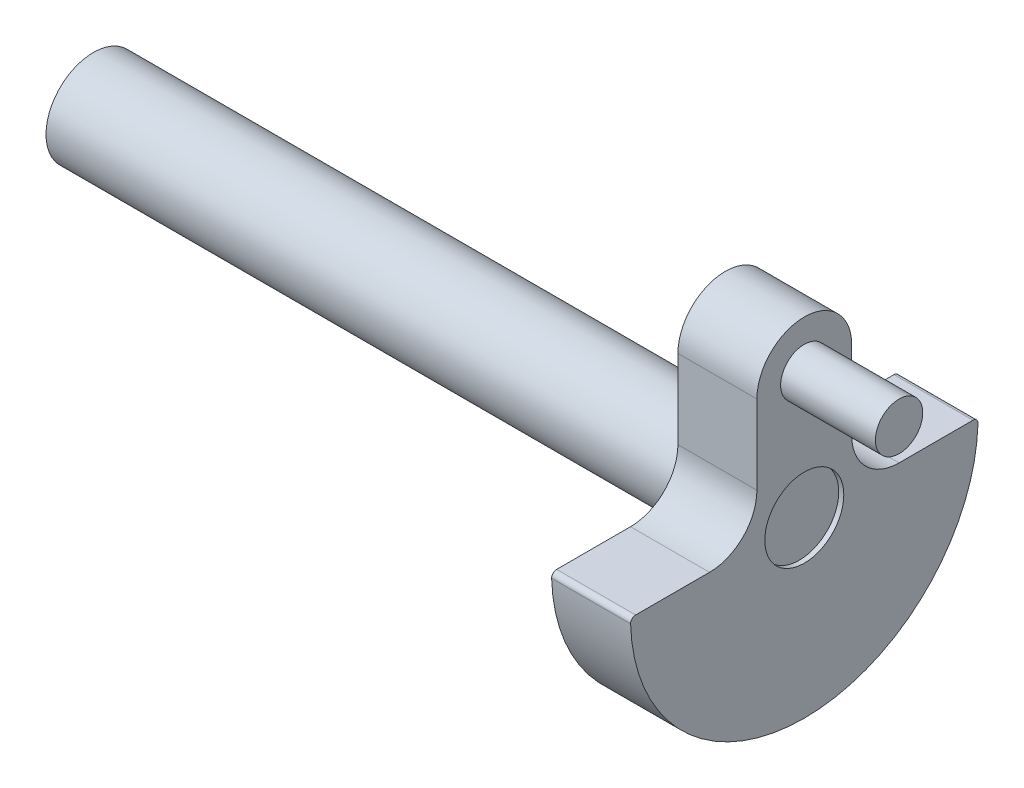
ISO-10303-21;
HEADER;
FILE_DESCRIPTION(('STEP AP214'),'2;1');
FILE_NAME('part.step','',(''),(''),'','','');
FILE_SCHEMA(('AUTOMOTIVE_DESIGN { 1 0 10303 214 1 1 1 1 }'));
ENDSEC;
DATA;
#1=APPLICATION_CONTEXT('core data for automotive mechanical design processes');
#2=APPLICATION_PROTOCOL_DEFINITION('international standard','automotive_design',2000,#1);
#3=PRODUCT_CONTEXT('',#1,'mechanical');
#4=PRODUCT('Part','Part','',(#3));
#5=PRODUCT_RELATED_PRODUCT_CATEGORY('part','',(#4));
#6=PRODUCT_DEFINITION_FORMATION('','',#4);
#7=PRODUCT_DEFINITION_CONTEXT('part definition',#1,'design');
#8=PRODUCT_DEFINITION('design','',#6,#7);
#9=PRODUCT_DEFINITION_SHAPE('','',#8);
#10=(LENGTH_UNIT() NAMED_UNIT(*) SI_UNIT(.MILLI.,.METRE.));
#11=(NAMED_UNIT(*) PLANE_ANGLE_UNIT() SI_UNIT($,.RADIAN.));
#12=(NAMED_UNIT(*) SI_UNIT($,.STERADIAN.) SOLID_ANGLE_UNIT());
#13=UNCERTAINTY_MEASURE_WITH_UNIT(LENGTH_MEASURE(1.E-05),#10,'distance_accuracy_value','');
#14=(GEOMETRIC_REPRESENTATION_CONTEXT(3) GLOBAL_UNCERTAINTY_ASSIGNED_CONTEXT((#13)) GLOBAL_UNIT_ASSIGNED_CONTEXT((#10,
#11,#12)) REPRESENTATION_CONTEXT('',''));
#15=CARTESIAN_POINT('',(0.,0.,0.));
#16=DIRECTION('',(0.,0.,1.));
#17=DIRECTION('',(1.,0.,0.));
#18=AXIS2_PLACEMENT_3D('',#15,#16,#17);
#19=CARTESIAN_POINT('',(3.96875,-0.254,8.4734439021274));
#20=DIRECTION('',(-1.,0.,0.));
#21=DIRECTION('',(0.,0.,1.));
#22=AXIS2_PLACEMENT_3D('',#19,#20,#21);
#23=CYLINDRICAL_SURFACE('',#22,0.254000000000001);
#24=CARTESIAN_POINT('',(0.,-0.254,8.4734439021274));
#25=DIRECTION('',(1.,0.,0.));
#26=DIRECTION('',(0.,0.,1.));
#27=AXIS2_PLACEMENT_3D('',#24,#25,#26);
#28=CIRCLE('',#27,0.254000000000001);
#29=CARTESIAN_POINT('',(0.,0.,8.4734439021274));
#30=VERTEX_POINT('',#29);
#31=CARTESIAN_POINT('',(0.,-0.261610486891384,8.7273298617417));
#32=VERTEX_POINT('',#31);
#33=EDGE_CURVE('E147',#30,#32,#28,.T.);
#34=ORIENTED_EDGE('',*,*,#33,.T.);
#35=DIRECTION('',(-1.,0.,0.));
#36=VECTOR('',#35,1.);
#37=CARTESIAN_POINT('',(3.96875,-0.261610486891384,8.7273298617417));
#38=LINE('',#37,#36);
#39=CARTESIAN_POINT('',(3.96875,-0.261610486891384,8.7273298617417));
#40=VERTEX_POINT('',#39);
#41=EDGE_CURVE('E11',#40,#32,#38,.T.);
#42=ORIENTED_EDGE('',*,*,#41,.F.);
#43=CARTESIAN_POINT('',(3.96875,-0.254,8.4734439021274));
#44=DIRECTION('',(1.,0.,0.));
#45=DIRECTION('',(0.,0.,1.));
#46=AXIS2_PLACEMENT_3D('',#43,#44,#45);
#47=CIRCLE('',#46,0.254000000000001);
#48=CARTESIAN_POINT('',(3.96875,0.,8.4734439021274));
#49=VERTEX_POINT('',#48);
#50=EDGE_CURVE('E166',#49,#40,#47,.T.);
#51=ORIENTED_EDGE('',*,*,#50,.F.);
#52=DIRECTION('',(-1.,0.,0.));
#53=VECTOR('',#52,1.);
#54=CARTESIAN_POINT('',(3.96875,0.,8.4734439021274));
#55=LINE('',#54,#53);
#56=EDGE_CURVE('E143',#49,#30,#55,.T.);
#57=ORIENTED_EDGE('',*,*,#56,.T.);
#58=EDGE_LOOP('',(#34,#42,#51,#57));
#59=FACE_BOUND('',#58,.T.);
#60=ADVANCED_FACE('F39',(#59),#23,.T.);
#61=CARTESIAN_POINT('',(3.96875,0.,0.));
#62=DIRECTION('',(-1.,0.,0.));
#63=DIRECTION('',(0.,0.,1.));
#64=AXIS2_PLACEMENT_3D('',#61,#62,#63);
#65=CYLINDRICAL_SURFACE('',#64,8.73125);
#66=CARTESIAN_POINT('',(0.,0.,0.));
#67=DIRECTION('',(1.,0.,0.));
#68=DIRECTION('',(0.,0.,-1.));
#69=AXIS2_PLACEMENT_3D('',#66,#67,#68);
#70=CIRCLE('',#69,8.73125);
#71=CARTESIAN_POINT('',(0.,-0.261610486891387,-8.7273298617417));
#72=VERTEX_POINT('',#71);
#73=EDGE_CURVE('E150',#32,#72,#70,.T.);
#74=ORIENTED_EDGE('',*,*,#73,.T.);
#75=DIRECTION('',(-1.,0.,0.));
#76=VECTOR('',#75,1.);
#77=CARTESIAN_POINT('',(3.96875,-0.261610486891387,-8.7273298617417));
#78=LINE('',#77,#76);
#79=CARTESIAN_POINT('',(3.96875,-0.261610486891387,-8.7273298617417));
#80=VERTEX_POINT('',#79);
#81=EDGE_CURVE('E47',#80,#72,#78,.T.);
#82=ORIENTED_EDGE('',*,*,#81,.F.);
#83=CARTESIAN_POINT('',(3.96875,0.,0.));
#84=DIRECTION('',(1.,0.,0.));
#85=DIRECTION('',(0.,0.,-1.));
#86=AXIS2_PLACEMENT_3D('',#83,#84,#85);
#87=CIRCLE('',#86,8.73125);
#88=EDGE_CURVE('E104',#40,#80,#87,.T.);
#89=ORIENTED_EDGE('',*,*,#88,.F.);
#90=ORIENTED_EDGE('',*,*,#41,.T.);
#91=EDGE_LOOP('',(#74,#82,#89,#90));
#92=FACE_BOUND('',#91,.T.);
#93=ADVANCED_FACE('F261',(#92),#65,.T.);
#94=CARTESIAN_POINT('',(3.96875,-0.254,-8.4734439021274));
#95=DIRECTION('',(-1.,0.,0.));
#96=DIRECTION('',(0.,0.,1.));
#97=AXIS2_PLACEMENT_3D('',#94,#95,#96);
#98=CYLINDRICAL_SURFACE('',#97,0.254000000000001);
#99=CARTESIAN_POINT('',(0.,-0.254,-8.4734439021274));
#100=DIRECTION('',(1.,0.,0.));
#101=DIRECTION('',(0.,0.,1.));
#102=AXIS2_PLACEMENT_3D('',#99,#100,#101);
#103=CIRCLE('',#102,0.254000000000001);
#104=CARTESIAN_POINT('',(0.,0.,-8.4734439021274));
#105=VERTEX_POINT('',#104);
#106=EDGE_CURVE('E153',#72,#105,#103,.T.);
#107=ORIENTED_EDGE('',*,*,#106,.T.);
#108=DIRECTION('',(-1.,0.,0.));
#109=VECTOR('',#108,1.);
#110=CARTESIAN_POINT('',(3.96875,0.,-8.4734439021274));
#111=LINE('',#110,#109);
#112=CARTESIAN_POINT('',(3.96875,0.,-8.4734439021274));
#113=VERTEX_POINT('',#112);
#114=EDGE_CURVE('E179',#113,#105,#111,.T.);
#115=ORIENTED_EDGE('',*,*,#114,.F.);
#116=CARTESIAN_POINT('',(3.96875,-0.254,-8.4734439021274));
#117=DIRECTION('',(1.,0.,0.));
#118=DIRECTION('',(0.,0.,1.));
#119=AXIS2_PLACEMENT_3D('',#116,#117,#118);
#120=CIRCLE('',#119,0.254000000000001);
#121=EDGE_CURVE('E187',#80,#113,#120,.T.);
#122=ORIENTED_EDGE('',*,*,#121,.F.);
#123=ORIENTED_EDGE('',*,*,#81,.T.);
#124=EDGE_LOOP('',(#107,#115,#122,#123));
#125=FACE_BOUND('',#124,.T.);
#126=ADVANCED_FACE('F185',(#125),#98,.T.);
#127=CARTESIAN_POINT('',(3.96875,0.,-4.76250000000002));
#128=DIRECTION('',(0.,-1.,0.));
#129=DIRECTION('',(0.,0.,-1.));
#130=AXIS2_PLACEMENT_3D('',#127,#128,#129);
#131=PLANE('',#130);
#132=DIRECTION('',(0.,0.,1.));
#133=VECTOR('',#132,1.);
#134=CARTESIAN_POINT('',(0.,0.,-4.76250000000002));
#135=LINE('',#134,#133);
#136=CARTESIAN_POINT('',(0.,0.,-4.76250000000002));
#137=VERTEX_POINT('',#136);
#138=EDGE_CURVE('E155',#105,#137,#135,.T.);
#139=ORIENTED_EDGE('',*,*,#138,.T.);
#140=DIRECTION('',(-1.,0.,0.));
#141=VECTOR('',#140,1.);
#142=CARTESIAN_POINT('',(3.96875,0.,-4.76250000000002));
#143=LINE('',#142,#141);
#144=CARTESIAN_POINT('',(3.96875,0.,-4.76250000000002));
#145=VERTEX_POINT('',#144);
#146=EDGE_CURVE('E176',#145,#137,#143,.T.);
#147=ORIENTED_EDGE('',*,*,#146,.F.);
#148=DIRECTION('',(0.,0.,1.));
#149=VECTOR('',#148,1.);
#150=CARTESIAN_POINT('',(3.96875,0.,-4.76250000000002));
#151=LINE('',#150,#149);
#152=EDGE_CURVE('E205',#113,#145,#151,.T.);
#153=ORIENTED_EDGE('',*,*,#152,.F.);
#154=ORIENTED_EDGE('',*,*,#114,.T.);
#155=EDGE_LOOP('',(#139,#147,#153,#154));
#156=FACE_BOUND('',#155,.T.);
#157=ADVANCED_FACE('F196',(#156),#131,.F.);
#158=CARTESIAN_POINT('',(3.96875,2.38125,-4.7625));
#159=DIRECTION('',(-1.,0.,0.));
#160=DIRECTION('',(0.,0.,1.));
#161=AXIS2_PLACEMENT_3D('',#158,#159,#160);
#162=CYLINDRICAL_SURFACE('',#161,2.38125);
#163=CARTESIAN_POINT('',(0.,2.38125,-4.7625));
#164=DIRECTION('',(-1.,0.,0.));
#165=DIRECTION('',(0.,0.,1.));
#166=AXIS2_PLACEMENT_3D('',#163,#164,#165);
#167=CIRCLE('',#166,2.38125);
#168=CARTESIAN_POINT('',(0.,2.38125,-2.38125));
#169=VERTEX_POINT('',#168);
#170=EDGE_CURVE('E157',#137,#169,#167,.T.);
#171=ORIENTED_EDGE('',*,*,#170,.T.);
#172=DIRECTION('',(-1.,0.,0.));
#173=VECTOR('',#172,1.);
#174=CARTESIAN_POINT('',(3.96875,2.38125,-2.38125));
#175=LINE('',#174,#173);
#176=CARTESIAN_POINT('',(3.96875,2.38125,-2.38125));
#177=VERTEX_POINT('',#176);
#178=EDGE_CURVE('E173',#177,#169,#175,.T.);
#179=ORIENTED_EDGE('',*,*,#178,.F.);
#180=CARTESIAN_POINT('',(3.96875,2.38125,-4.7625));
#181=DIRECTION('',(-1.,0.,0.));
#182=DIRECTION('',(0.,0.,1.));
#183=AXIS2_PLACEMENT_3D('',#180,#181,#182);
#184=CIRCLE('',#183,2.38125);
#185=EDGE_CURVE('E202',#145,#177,#184,.T.);
#186=ORIENTED_EDGE('',*,*,#185,.F.);
#187=ORIENTED_EDGE('',*,*,#146,.T.);
#188=EDGE_LOOP('',(#171,#179,#186,#187));
#189=FACE_BOUND('',#188,.T.);
#190=ADVANCED_FACE('F200',(#189),#162,.F.);
#191=CARTESIAN_POINT('',(3.96875,6.35,-2.38125));
#192=DIRECTION('',(0.,0.,1.));
#193=DIRECTION('',(0.,-1.,0.));
#194=AXIS2_PLACEMENT_3D('',#191,#192,#193);
#195=PLANE('',#194);
#196=DIRECTION('',(0.,1.,0.));
#197=VECTOR('',#196,1.);
#198=CARTESIAN_POINT('',(0.,6.35,-2.38125));
#199=LINE('',#198,#197);
#200=CARTESIAN_POINT('',(0.,6.35,-2.38125));
#201=VERTEX_POINT('',#200);
#202=EDGE_CURVE('E159',#169,#201,#199,.T.);
#203=ORIENTED_EDGE('',*,*,#202,.T.);
#204=DIRECTION('',(-1.,0.,0.));
#205=VECTOR('',#204,1.);
#206=CARTESIAN_POINT('',(3.96875,6.35,-2.38125));
#207=LINE('',#206,#205);
#208=CARTESIAN_POINT('',(3.96875,6.35,-2.38125));
#209=VERTEX_POINT('',#208);
#210=EDGE_CURVE('E170',#209,#201,#207,.T.);
#211=ORIENTED_EDGE('',*,*,#210,.F.);
#212=DIRECTION('',(0.,1.,0.));
#213=VECTOR('',#212,1.);
#214=CARTESIAN_POINT('',(3.96875,6.35,-2.38125));
#215=LINE('',#214,#213);
#216=EDGE_CURVE('E204',#177,#209,#215,.T.);
#217=ORIENTED_EDGE('',*,*,#216,.F.);
#218=ORIENTED_EDGE('',*,*,#178,.T.);
#219=EDGE_LOOP('',(#203,#211,#217,#218));
#220=FACE_BOUND('',#219,.T.);
#221=ADVANCED_FACE('F273',(#220),#195,.F.);
#222=CARTESIAN_POINT('',(3.96875,6.35,0.));
#223=DIRECTION('',(-1.,0.,0.));
#224=DIRECTION('',(0.,0.,1.));
#225=AXIS2_PLACEMENT_3D('',#222,#223,#224);
#226=CYLINDRICAL_SURFACE('',#225,2.38125);
#227=CARTESIAN_POINT('',(0.,6.35,0.));
#228=DIRECTION('',(1.,0.,0.));
#229=DIRECTION('',(0.,0.,-1.));
#230=AXIS2_PLACEMENT_3D('',#227,#228,#229);
#231=CIRCLE('',#230,2.38125);
#232=CARTESIAN_POINT('',(0.,6.35,2.38125));
#233=VERTEX_POINT('',#232);
#234=EDGE_CURVE('E161',#201,#233,#231,.T.);
#235=ORIENTED_EDGE('',*,*,#234,.T.);
#236=DIRECTION('',(-1.,0.,0.));
#237=VECTOR('',#236,1.);
#238=CARTESIAN_POINT('',(3.96875,6.35,2.38125));
#239=LINE('',#238,#237);
#240=CARTESIAN_POINT('',(3.96875,6.35,2.38125));
#241=VERTEX_POINT('',#240);
#242=EDGE_CURVE('E138',#241,#233,#239,.T.);
#243=ORIENTED_EDGE('',*,*,#242,.F.);
#244=CARTESIAN_POINT('',(3.96875,6.35,0.));
#245=DIRECTION('',(1.,0.,0.));
#246=DIRECTION('',(0.,0.,-1.));
#247=AXIS2_PLACEMENT_3D('',#244,#245,#246);
#248=CIRCLE('',#247,2.38125);
#249=EDGE_CURVE('E129',#209,#241,#248,.T.);
#250=ORIENTED_EDGE('',*,*,#249,.F.);
#251=ORIENTED_EDGE('',*,*,#210,.T.);
#252=EDGE_LOOP('',(#235,#243,#250,#251));
#253=FACE_BOUND('',#252,.T.);
#254=ADVANCED_FACE('F270',(#253),#226,.T.);
#255=CARTESIAN_POINT('',(3.96875,6.35,2.38125));
#256=DIRECTION('',(0.,0.,-1.));
#257=DIRECTION('',(0.,1.,0.));
#258=AXIS2_PLACEMENT_3D('',#255,#256,#257);
#259=PLANE('',#258);
#260=DIRECTION('',(0.,-1.,0.));
#261=VECTOR('',#260,1.);
#262=CARTESIAN_POINT('',(0.,6.35,2.38125));
#263=LINE('',#262,#261);
#264=CARTESIAN_POINT('',(0.,2.38125000000002,2.38125));
#265=VERTEX_POINT('',#264);
#266=EDGE_CURVE('E137',#233,#265,#263,.T.);
#267=ORIENTED_EDGE('',*,*,#266,.T.);
#268=DIRECTION('',(-1.,0.,0.));
#269=VECTOR('',#268,1.);
#270=CARTESIAN_POINT('',(3.96875,2.38125000000002,2.38125));
#271=LINE('',#270,#269);
#272=CARTESIAN_POINT('',(3.96875,2.38125000000002,2.38125));
#273=VERTEX_POINT('',#272);
#274=EDGE_CURVE('E134',#273,#265,#271,.T.);
#275=ORIENTED_EDGE('',*,*,#274,.F.);
#276=DIRECTION('',(0.,-1.,0.));
#277=VECTOR('',#276,1.);
#278=CARTESIAN_POINT('',(3.96875,6.35,2.38125));
#279=LINE('',#278,#277);
#280=EDGE_CURVE('E123',#241,#273,#279,.T.);
#281=ORIENTED_EDGE('',*,*,#280,.F.);
#282=ORIENTED_EDGE('',*,*,#242,.T.);
#283=EDGE_LOOP('',(#267,#275,#281,#282));
#284=FACE_BOUND('',#283,.T.);
#285=ADVANCED_FACE('F135',(#284),#259,.F.);
#286=CARTESIAN_POINT('',(3.96875,2.38125,4.7625));
#287=DIRECTION('',(-1.,0.,0.));
#288=DIRECTION('',(0.,0.,1.));
#289=AXIS2_PLACEMENT_3D('',#286,#287,#288);
#290=CYLINDRICAL_SURFACE('',#289,2.38125);
#291=CARTESIAN_POINT('',(0.,2.38125,4.7625));
#292=DIRECTION('',(-1.,0.,0.));
#293=DIRECTION('',(0.,0.,1.));
#294=AXIS2_PLACEMENT_3D('',#291,#292,#293);
#295=CIRCLE('',#294,2.38125);
#296=CARTESIAN_POINT('',(0.,0.,4.76250000000002));
#297=VERTEX_POINT('',#296);
#298=EDGE_CURVE('E90',#265,#297,#295,.T.);
#299=ORIENTED_EDGE('',*,*,#298,.T.);
#300=DIRECTION('',(-1.,0.,0.));
#301=VECTOR('',#300,1.);
#302=CARTESIAN_POINT('',(3.96875,0.,4.76250000000002));
#303=LINE('',#302,#301);
#304=CARTESIAN_POINT('',(3.96875,0.,4.76250000000002));
#305=VERTEX_POINT('',#304);
#306=EDGE_CURVE('E139',#305,#297,#303,.T.);
#307=ORIENTED_EDGE('',*,*,#306,.F.);
#308=CARTESIAN_POINT('',(3.96875,2.38125,4.7625));
#309=DIRECTION('',(-1.,0.,0.));
#310=DIRECTION('',(0.,0.,1.));
#311=AXIS2_PLACEMENT_3D('',#308,#309,#310);
#312=CIRCLE('',#311,2.38125);
#313=EDGE_CURVE('E127',#273,#305,#312,.T.);
#314=ORIENTED_EDGE('',*,*,#313,.F.);
#315=ORIENTED_EDGE('',*,*,#274,.T.);
#316=EDGE_LOOP('',(#299,#307,#314,#315));
#317=FACE_BOUND('',#316,.T.);
#318=ADVANCED_FACE('F141',(#317),#290,.F.);
#319=CARTESIAN_POINT('',(3.96875,0.,8.4734439021274));
#320=DIRECTION('',(0.,-1.,0.));
#321=DIRECTION('',(0.,0.,-1.));
#322=AXIS2_PLACEMENT_3D('',#319,#320,#321);
#323=PLANE('',#322);
#324=DIRECTION('',(0.,0.,1.));
#325=VECTOR('',#324,1.);
#326=CARTESIAN_POINT('',(0.,0.,8.4734439021274));
#327=LINE('',#326,#325);
#328=EDGE_CURVE('E96',#297,#30,#327,.T.);
#329=ORIENTED_EDGE('',*,*,#328,.T.);
#330=ORIENTED_EDGE('',*,*,#56,.F.);
#331=DIRECTION('',(0.,0.,1.));
#332=VECTOR('',#331,1.);
#333=CARTESIAN_POINT('',(3.96875,0.,8.4734439021274));
#334=LINE('',#333,#332);
#335=EDGE_CURVE('E55',#305,#49,#334,.T.);
#336=ORIENTED_EDGE('',*,*,#335,.F.);
#337=ORIENTED_EDGE('',*,*,#306,.T.);
#338=EDGE_LOOP('',(#329,#330,#336,#337));
#339=FACE_BOUND('',#338,.T.);
#340=ADVANCED_FACE('F242',(#339),#323,.F.);
#341=CARTESIAN_POINT('',(3.96875,-0.254,8.4734439021274));
#342=DIRECTION('',(-1.,0.,0.));
#343=DIRECTION('',(0.,0.,1.));
#344=AXIS2_PLACEMENT_3D('',#341,#342,#343);
#345=PLANE('',#344);
#346=CARTESIAN_POINT('',(3.96875,0.,0.));
#347=DIRECTION('',(1.,0.,0.));
#348=DIRECTION('',(0.,0.,-1.));
#349=AXIS2_PLACEMENT_3D('',#346,#347,#348);
#350=CIRCLE('',#349,1.984375);
#351=CARTESIAN_POINT('',(3.96875,0.,-1.984375));
#352=VERTEX_POINT('',#351);
#353=EDGE_CURVE('E225',#352,#352,#350,.T.);
#354=ORIENTED_EDGE('',*,*,#353,.F.);
#355=EDGE_LOOP('',(#354));
#356=FACE_BOUND('',#355,.T.);
#357=CARTESIAN_POINT('',(3.96875,6.35,0.));
#358=DIRECTION('',(-1.,0.,0.));
#359=DIRECTION('',(0.,0.,1.));
#360=AXIS2_PLACEMENT_3D('',#357,#358,#359);
#361=CIRCLE('',#360,1.190625);
#362=CARTESIAN_POINT('',(3.96875,6.35,1.190625));
#363=VERTEX_POINT('',#362);
#364=EDGE_CURVE('E216',#363,#363,#361,.T.);
#365=ORIENTED_EDGE('',*,*,#364,.T.);
#366=EDGE_LOOP('',(#365));
#367=FACE_BOUND('',#366,.T.);
#368=ORIENTED_EDGE('',*,*,#50,.T.);
#369=ORIENTED_EDGE('',*,*,#88,.T.);
#370=ORIENTED_EDGE('',*,*,#121,.T.);
#371=ORIENTED_EDGE('',*,*,#152,.T.);
#372=ORIENTED_EDGE('',*,*,#185,.T.);
#373=ORIENTED_EDGE('',*,*,#216,.T.);
#374=ORIENTED_EDGE('',*,*,#249,.T.);
#375=ORIENTED_EDGE('',*,*,#280,.T.);
#376=ORIENTED_EDGE('',*,*,#313,.T.);
#377=ORIENTED_EDGE('',*,*,#335,.T.);
#378=EDGE_LOOP('',(#368,#369,#370,#371,#372,#373,#374,#375,#376,#377));
#379=FACE_BOUND('',#378,.T.);
#380=ADVANCED_FACE('F125',(#356,#367,#379),#345,.F.);
#381=CARTESIAN_POINT('',(0.,-0.254,8.4734439021274));
#382=DIRECTION('',(-1.,0.,0.));
#383=DIRECTION('',(0.,0.,1.));
#384=AXIS2_PLACEMENT_3D('',#381,#382,#383);
#385=PLANE('',#384);
#386=CARTESIAN_POINT('',(0.,0.,0.));
#387=DIRECTION('',(-1.,0.,0.));
#388=DIRECTION('',(0.,0.,1.));
#389=AXIS2_PLACEMENT_3D('',#386,#387,#388);
#390=CIRCLE('',#389,2.38125);
#391=CARTESIAN_POINT('',(0.,0.,2.38125));
#392=VERTEX_POINT('',#391);
#393=EDGE_CURVE('E213',#392,#392,#390,.T.);
#394=ORIENTED_EDGE('',*,*,#393,.F.);
#395=EDGE_LOOP('',(#394));
#396=FACE_BOUND('',#395,.T.);
#397=ORIENTED_EDGE('',*,*,#33,.F.);
#398=ORIENTED_EDGE('',*,*,#328,.F.);
#399=ORIENTED_EDGE('',*,*,#298,.F.);
#400=ORIENTED_EDGE('',*,*,#266,.F.);
#401=ORIENTED_EDGE('',*,*,#234,.F.);
#402=ORIENTED_EDGE('',*,*,#202,.F.);
#403=ORIENTED_EDGE('',*,*,#170,.F.);
#404=ORIENTED_EDGE('',*,*,#138,.F.);
#405=ORIENTED_EDGE('',*,*,#106,.F.);
#406=ORIENTED_EDGE('',*,*,#73,.F.);
#407=EDGE_LOOP('',(#397,#398,#399,#400,#401,#402,#403,#404,#405,#406));
#408=FACE_BOUND('',#407,.T.);
#409=ADVANCED_FACE('F191',(#396,#408),#385,.T.);
#410=CARTESIAN_POINT('',(-31.75,0.,0.));
#411=DIRECTION('',(1.,0.,0.));
#412=DIRECTION('',(0.,0.,-1.));
#413=AXIS2_PLACEMENT_3D('',#410,#411,#412);
#414=CYLINDRICAL_SURFACE('',#413,2.38125);
#415=CARTESIAN_POINT('',(-31.75,0.,0.));
#416=DIRECTION('',(-1.,0.,0.));
#417=DIRECTION('',(0.,0.,1.));
#418=AXIS2_PLACEMENT_3D('',#415,#416,#417);
#419=CIRCLE('',#418,2.38125);
#420=CARTESIAN_POINT('',(-31.75,0.,2.38125));
#421=VERTEX_POINT('',#420);
#422=EDGE_CURVE('E151',#421,#421,#419,.T.);
#423=ORIENTED_EDGE('',*,*,#422,.F.);
#424=EDGE_LOOP('',(#423));
#425=FACE_BOUND('',#424,.T.);
#426=ORIENTED_EDGE('',*,*,#393,.T.);
#427=EDGE_LOOP('',(#426));
#428=FACE_BOUND('',#427,.T.);
#429=ADVANCED_FACE('F257',(#425,#428),#414,.T.);
#430=CARTESIAN_POINT('',(-31.75,0.,0.));
#431=DIRECTION('',(-1.,0.,0.));
#432=DIRECTION('',(0.,0.,1.));
#433=AXIS2_PLACEMENT_3D('',#430,#431,#432);
#434=PLANE('',#433);
#435=ORIENTED_EDGE('',*,*,#422,.T.);
#436=EDGE_LOOP('',(#435));
#437=FACE_BOUND('',#436,.T.);
#438=ADVANCED_FACE('F248',(#437),#434,.T.);
#439=CARTESIAN_POINT('',(8.73125,6.35,0.));
#440=DIRECTION('',(-1.,0.,0.));
#441=DIRECTION('',(0.,0.,1.));
#442=AXIS2_PLACEMENT_3D('',#439,#440,#441);
#443=CYLINDRICAL_SURFACE('',#442,1.190625);
#444=CARTESIAN_POINT('',(8.73125,6.35,0.));
#445=DIRECTION('',(-1.,0.,0.));
#446=DIRECTION('',(0.,0.,1.));
#447=AXIS2_PLACEMENT_3D('',#444,#445,#446);
#448=CIRCLE('',#447,1.190625);
#449=CARTESIAN_POINT('',(8.73125,6.35,1.190625));
#450=VERTEX_POINT('',#449);
#451=EDGE_CURVE('E221',#450,#450,#448,.T.);
#452=ORIENTED_EDGE('',*,*,#451,.T.);
#453=EDGE_LOOP('',(#452));
#454=FACE_BOUND('',#453,.T.);
#455=ORIENTED_EDGE('',*,*,#364,.F.);
#456=EDGE_LOOP('',(#455));
#457=FACE_BOUND('',#456,.T.);
#458=ADVANCED_FACE('F246',(#454,#457),#443,.T.);
#459=CARTESIAN_POINT('',(8.73125,0.,0.));
#460=DIRECTION('',(-1.,0.,0.));
#461=DIRECTION('',(0.,0.,1.));
#462=AXIS2_PLACEMENT_3D('',#459,#460,#461);
#463=PLANE('',#462);
#464=ORIENTED_EDGE('',*,*,#451,.F.);
#465=EDGE_LOOP('',(#464));
#466=FACE_BOUND('',#465,.T.);
#467=ADVANCED_FACE('F236',(#466),#463,.F.);
#468=CARTESIAN_POINT('',(3.71475,0.,0.));
#469=DIRECTION('',(1.,0.,0.));
#470=DIRECTION('',(0.,0.,-1.));
#471=AXIS2_PLACEMENT_3D('',#468,#469,#470);
#472=CYLINDRICAL_SURFACE('',#471,1.984375);
#473=CARTESIAN_POINT('',(3.71475,0.,0.));
#474=DIRECTION('',(1.,0.,0.));
#475=DIRECTION('',(0.,0.,-1.));
#476=AXIS2_PLACEMENT_3D('',#473,#474,#475);
#477=CIRCLE('',#476,1.984375);
#478=CARTESIAN_POINT('',(3.71475,0.,-1.984375));
#479=VERTEX_POINT('',#478);
#480=EDGE_CURVE('E224',#479,#479,#477,.T.);
#481=ORIENTED_EDGE('',*,*,#480,.F.);
#482=EDGE_LOOP('',(#481));
#483=FACE_BOUND('',#482,.T.);
#484=ORIENTED_EDGE('',*,*,#353,.T.);
#485=EDGE_LOOP('',(#484));
#486=FACE_BOUND('',#485,.T.);
#487=ADVANCED_FACE('F233',(#483,#486),#472,.F.);
#488=CARTESIAN_POINT('',(3.71475,0.,0.));
#489=DIRECTION('',(1.,0.,0.));
#490=DIRECTION('',(0.,0.,-1.));
#491=AXIS2_PLACEMENT_3D('',#488,#489,#490);
#492=PLANE('',#491);
#493=ORIENTED_EDGE('',*,*,#480,.T.);
#494=EDGE_LOOP('',(#493));
#495=FACE_BOUND('',#494,.T.);
#496=ADVANCED_FACE('F231',(#495),#492,.T.);
#497=CLOSED_SHELL('',(#60,#93,#126,#157,#190,#221,#254,#285,#318,#340,#380,#409,#429,#438,#458,
#467,#487,#496));
#498=MANIFOLD_SOLID_BREP('B2',#497);
#499=ADVANCED_BREP_SHAPE_REPRESENTATION('',(#18,#498),#14);
#500=SHAPE_DEFINITION_REPRESENTATION(#9,#499);
ENDSEC;
END-ISO-10303-21;
